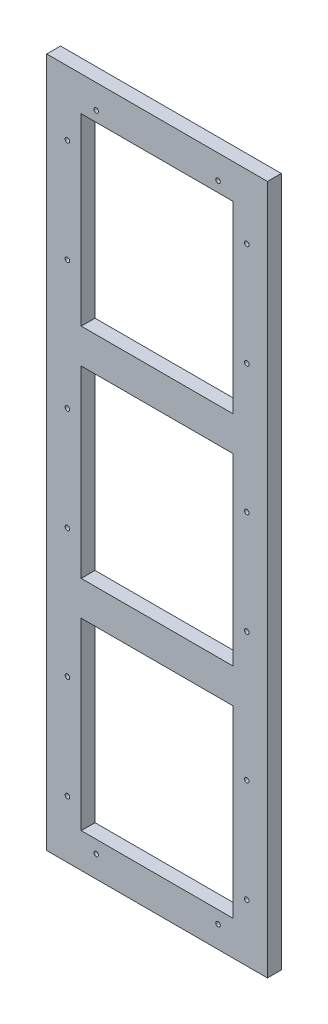
ISO-10303-21;
HEADER;
FILE_DESCRIPTION(('STEP AP214'),'2;1');
FILE_NAME('part.step','',(''),(''),'','','');
FILE_SCHEMA(('AUTOMOTIVE_DESIGN { 1 0 10303 214 1 1 1 1 }'));
ENDSEC;
DATA;
#1=APPLICATION_CONTEXT('core data for automotive mechanical design processes');
#2=APPLICATION_PROTOCOL_DEFINITION('international standard','automotive_design',2000,#1);
#3=PRODUCT_CONTEXT('',#1,'mechanical');
#4=PRODUCT('Part','Part','',(#3));
#5=PRODUCT_RELATED_PRODUCT_CATEGORY('part','',(#4));
#6=PRODUCT_DEFINITION_FORMATION('','',#4);
#7=PRODUCT_DEFINITION_CONTEXT('part definition',#1,'design');
#8=PRODUCT_DEFINITION('design','',#6,#7);
#9=PRODUCT_DEFINITION_SHAPE('','',#8);
#10=(LENGTH_UNIT() NAMED_UNIT(*) SI_UNIT(.MILLI.,.METRE.));
#11=(NAMED_UNIT(*) PLANE_ANGLE_UNIT() SI_UNIT($,.RADIAN.));
#12=(NAMED_UNIT(*) SI_UNIT($,.STERADIAN.) SOLID_ANGLE_UNIT());
#13=UNCERTAINTY_MEASURE_WITH_UNIT(LENGTH_MEASURE(1.E-05),#10,'distance_accuracy_value','');
#14=(GEOMETRIC_REPRESENTATION_CONTEXT(3) GLOBAL_UNCERTAINTY_ASSIGNED_CONTEXT((#13)) GLOBAL_UNIT_ASSIGNED_CONTEXT((#10,
#11,#12)) REPRESENTATION_CONTEXT('',''));
#15=CARTESIAN_POINT('',(0.,0.,0.));
#16=DIRECTION('',(0.,0.,1.));
#17=DIRECTION('',(1.,0.,0.));
#18=AXIS2_PLACEMENT_3D('',#15,#16,#17);
#19=CARTESIAN_POINT('',(0.,0.,6.));
#20=DIRECTION('',(0.,0.,-1.));
#21=DIRECTION('',(-1.,0.,0.));
#22=AXIS2_PLACEMENT_3D('',#19,#20,#21);
#23=PLANE('',#22);
#24=CARTESIAN_POINT('',(26.5,-134.5,6.));
#25=DIRECTION('',(0.,0.,1.));
#26=DIRECTION('',(1.,0.,0.));
#27=AXIS2_PLACEMENT_3D('',#24,#25,#26);
#28=CIRCLE('',#27,1.);
#29=CARTESIAN_POINT('',(27.5,-134.5,6.));
#30=VERTEX_POINT('',#29);
#31=EDGE_CURVE('E708',#30,#30,#28,.T.);
#32=ORIENTED_EDGE('',*,*,#31,.F.);
#33=EDGE_LOOP('',(#32));
#34=FACE_BOUND('',#33,.T.);
#35=CARTESIAN_POINT('',(-26.5,145.5,6.));
#36=DIRECTION('',(0.,0.,1.));
#37=DIRECTION('',(1.,0.,0.));
#38=AXIS2_PLACEMENT_3D('',#35,#36,#37);
#39=CIRCLE('',#38,1.);
#40=CARTESIAN_POINT('',(-25.5,145.5,6.));
#41=VERTEX_POINT('',#40);
#42=EDGE_CURVE('E705',#41,#41,#39,.T.);
#43=ORIENTED_EDGE('',*,*,#42,.F.);
#44=EDGE_LOOP('',(#43));
#45=FACE_BOUND('',#44,.T.);
#46=CARTESIAN_POINT('',(26.5,145.5,6.));
#47=DIRECTION('',(0.,0.,1.));
#48=DIRECTION('',(1.,0.,0.));
#49=AXIS2_PLACEMENT_3D('',#46,#47,#48);
#50=CIRCLE('',#49,1.);
#51=CARTESIAN_POINT('',(27.5,145.5,6.));
#52=VERTEX_POINT('',#51);
#53=EDGE_CURVE('E703',#52,#52,#50,.T.);
#54=ORIENTED_EDGE('',*,*,#53,.F.);
#55=EDGE_LOOP('',(#54));
#56=FACE_BOUND('',#55,.T.);
#57=CARTESIAN_POINT('',(-26.5,-134.5,6.));
#58=DIRECTION('',(0.,0.,1.));
#59=DIRECTION('',(1.,0.,0.));
#60=AXIS2_PLACEMENT_3D('',#57,#58,#59);
#61=CIRCLE('',#60,1.);
#62=CARTESIAN_POINT('',(-25.5,-134.5,6.));
#63=VERTEX_POINT('',#62);
#64=EDGE_CURVE('E315',#63,#63,#61,.T.);
#65=ORIENTED_EDGE('',*,*,#64,.F.);
#66=EDGE_LOOP('',(#65));
#67=FACE_BOUND('',#66,.T.);
#68=CARTESIAN_POINT('',(39.,128.000000000001,6.));
#69=DIRECTION('',(0.,0.,1.));
#70=DIRECTION('',(1.,0.,0.));
#71=AXIS2_PLACEMENT_3D('',#68,#69,#70);
#72=CIRCLE('',#71,0.999999999999998);
#73=CARTESIAN_POINT('',(40.,128.000000000001,6.));
#74=VERTEX_POINT('',#73);
#75=EDGE_CURVE('E335',#74,#74,#72,.T.);
#76=ORIENTED_EDGE('',*,*,#75,.F.);
#77=EDGE_LOOP('',(#76));
#78=FACE_BOUND('',#77,.T.);
#79=CARTESIAN_POINT('',(39.,83.0000000000011,6.));
#80=DIRECTION('',(0.,0.,1.));
#81=DIRECTION('',(1.,0.,0.));
#82=AXIS2_PLACEMENT_3D('',#79,#80,#81);
#83=CIRCLE('',#82,0.999999999999998);
#84=CARTESIAN_POINT('',(40.,83.0000000000011,6.));
#85=VERTEX_POINT('',#84);
#86=EDGE_CURVE('E338',#85,#85,#83,.T.);
#87=ORIENTED_EDGE('',*,*,#86,.F.);
#88=EDGE_LOOP('',(#87));
#89=FACE_BOUND('',#88,.T.);
#90=CARTESIAN_POINT('',(-38.9999999999961,27.,6.));
#91=DIRECTION('',(0.,0.,1.));
#92=DIRECTION('',(1.,0.,0.));
#93=AXIS2_PLACEMENT_3D('',#90,#91,#92);
#94=CIRCLE('',#93,0.999999999999998);
#95=CARTESIAN_POINT('',(-37.9999999999961,27.,6.));
#96=VERTEX_POINT('',#95);
#97=EDGE_CURVE('E341',#96,#96,#94,.T.);
#98=ORIENTED_EDGE('',*,*,#97,.F.);
#99=EDGE_LOOP('',(#98));
#100=FACE_BOUND('',#99,.T.);
#101=CARTESIAN_POINT('',(39.0000000000039,27.0000000000011,6.));
#102=DIRECTION('',(0.,0.,1.));
#103=DIRECTION('',(1.,0.,0.));
#104=AXIS2_PLACEMENT_3D('',#101,#102,#103);
#105=CIRCLE('',#104,0.999999999999998);
#106=CARTESIAN_POINT('',(40.0000000000039,27.0000000000011,6.));
#107=VERTEX_POINT('',#106);
#108=EDGE_CURVE('E344',#107,#107,#105,.T.);
#109=ORIENTED_EDGE('',*,*,#108,.F.);
#110=EDGE_LOOP('',(#109));
#111=FACE_BOUND('',#110,.T.);
#112=CARTESIAN_POINT('',(39.0000000000039,-17.9999999999989,6.));
#113=DIRECTION('',(0.,0.,1.));
#114=DIRECTION('',(1.,0.,0.));
#115=AXIS2_PLACEMENT_3D('',#112,#113,#114);
#116=CIRCLE('',#115,0.999999999999998);
#117=CARTESIAN_POINT('',(40.0000000000039,-17.9999999999989,6.));
#118=VERTEX_POINT('',#117);
#119=EDGE_CURVE('E347',#118,#118,#116,.T.);
#120=ORIENTED_EDGE('',*,*,#119,.F.);
#121=EDGE_LOOP('',(#120));
#122=FACE_BOUND('',#121,.T.);
#123=CARTESIAN_POINT('',(-38.9999999999961,-18.,6.));
#124=DIRECTION('',(0.,0.,1.));
#125=DIRECTION('',(1.,0.,0.));
#126=AXIS2_PLACEMENT_3D('',#123,#124,#125);
#127=CIRCLE('',#126,0.999999999999998);
#128=CARTESIAN_POINT('',(-37.9999999999961,-18.,6.));
#129=VERTEX_POINT('',#128);
#130=EDGE_CURVE('E350',#129,#129,#127,.T.);
#131=ORIENTED_EDGE('',*,*,#130,.F.);
#132=EDGE_LOOP('',(#131));
#133=FACE_BOUND('',#132,.T.);
#134=CARTESIAN_POINT('',(-38.9999999999922,-74.,6.));
#135=DIRECTION('',(0.,0.,1.));
#136=DIRECTION('',(1.,0.,0.));
#137=AXIS2_PLACEMENT_3D('',#134,#135,#136);
#138=CIRCLE('',#137,0.999999999999998);
#139=CARTESIAN_POINT('',(-37.9999999999922,-74.,6.));
#140=VERTEX_POINT('',#139);
#141=EDGE_CURVE('E353',#140,#140,#138,.T.);
#142=ORIENTED_EDGE('',*,*,#141,.F.);
#143=EDGE_LOOP('',(#142));
#144=FACE_BOUND('',#143,.T.);
#145=CARTESIAN_POINT('',(39.0000000000078,-73.9999999999989,6.));
#146=DIRECTION('',(0.,0.,1.));
#147=DIRECTION('',(1.,0.,0.));
#148=AXIS2_PLACEMENT_3D('',#145,#146,#147);
#149=CIRCLE('',#148,0.999999999999998);
#150=CARTESIAN_POINT('',(40.0000000000078,-73.9999999999989,6.));
#151=VERTEX_POINT('',#150);
#152=EDGE_CURVE('E356',#151,#151,#149,.T.);
#153=ORIENTED_EDGE('',*,*,#152,.F.);
#154=EDGE_LOOP('',(#153));
#155=FACE_BOUND('',#154,.T.);
#156=CARTESIAN_POINT('',(39.0000000000078,-118.999999999999,6.));
#157=DIRECTION('',(0.,0.,1.));
#158=DIRECTION('',(1.,0.,0.));
#159=AXIS2_PLACEMENT_3D('',#156,#157,#158);
#160=CIRCLE('',#159,0.999999999999998);
#161=CARTESIAN_POINT('',(40.0000000000079,-118.999999999999,6.));
#162=VERTEX_POINT('',#161);
#163=EDGE_CURVE('E331',#162,#162,#160,.T.);
#164=ORIENTED_EDGE('',*,*,#163,.F.);
#165=EDGE_LOOP('',(#164));
#166=FACE_BOUND('',#165,.T.);
#167=CARTESIAN_POINT('',(-38.9999999999922,-119.,6.));
#168=DIRECTION('',(0.,0.,1.));
#169=DIRECTION('',(1.,0.,0.));
#170=AXIS2_PLACEMENT_3D('',#167,#168,#169);
#171=CIRCLE('',#170,0.999999999999998);
#172=CARTESIAN_POINT('',(-37.9999999999921,-119.,6.));
#173=VERTEX_POINT('',#172);
#174=EDGE_CURVE('E326',#173,#173,#171,.T.);
#175=ORIENTED_EDGE('',*,*,#174,.F.);
#176=EDGE_LOOP('',(#175));
#177=FACE_BOUND('',#176,.T.);
#178=CARTESIAN_POINT('',(-39.,83.,6.));
#179=DIRECTION('',(0.,0.,1.));
#180=DIRECTION('',(1.,0.,0.));
#181=AXIS2_PLACEMENT_3D('',#178,#179,#180);
#182=CIRCLE('',#181,0.999999999999998);
#183=CARTESIAN_POINT('',(-38.,83.,6.));
#184=VERTEX_POINT('',#183);
#185=EDGE_CURVE('E322',#184,#184,#182,.T.);
#186=ORIENTED_EDGE('',*,*,#185,.F.);
#187=EDGE_LOOP('',(#186));
#188=FACE_BOUND('',#187,.T.);
#189=CARTESIAN_POINT('',(-39.,128.,6.));
#190=DIRECTION('',(0.,0.,1.));
#191=DIRECTION('',(1.,0.,0.));
#192=AXIS2_PLACEMENT_3D('',#189,#190,#191);
#193=CIRCLE('',#192,0.999999999999998);
#194=CARTESIAN_POINT('',(-38.,128.,6.));
#195=VERTEX_POINT('',#194);
#196=EDGE_CURVE('E279',#195,#195,#193,.T.);
#197=ORIENTED_EDGE('',*,*,#196,.F.);
#198=EDGE_LOOP('',(#197));
#199=FACE_BOUND('',#198,.T.);
#200=DIRECTION('',(0.,-1.,0.));
#201=VECTOR('',#200,1.);
#202=CARTESIAN_POINT('',(-33.,-49.,6.));
#203=LINE('',#202,#201);
#204=CARTESIAN_POINT('',(-33.,-49.,6.));
#205=VERTEX_POINT('',#204);
#206=CARTESIAN_POINT('',(-33.,-129.,6.));
#207=VERTEX_POINT('',#206);
#208=EDGE_CURVE('E188',#205,#207,#203,.T.);
#209=ORIENTED_EDGE('',*,*,#208,.F.);
#210=DIRECTION('',(-1.,0.,0.));
#211=VECTOR('',#210,1.);
#212=CARTESIAN_POINT('',(-33.,-49.,6.));
#213=LINE('',#212,#211);
#214=CARTESIAN_POINT('',(33.,-49.,6.));
#215=VERTEX_POINT('',#214);
#216=EDGE_CURVE('E196',#215,#205,#213,.T.);
#217=ORIENTED_EDGE('',*,*,#216,.F.);
#218=DIRECTION('',(0.,1.,0.));
#219=VECTOR('',#218,1.);
#220=CARTESIAN_POINT('',(33.,-49.,6.));
#221=LINE('',#220,#219);
#222=CARTESIAN_POINT('',(33.,-129.,6.));
#223=VERTEX_POINT('',#222);
#224=EDGE_CURVE('E193',#223,#215,#221,.T.);
#225=ORIENTED_EDGE('',*,*,#224,.F.);
#226=DIRECTION('',(1.,0.,0.));
#227=VECTOR('',#226,1.);
#228=CARTESIAN_POINT('',(-33.,-129.,6.));
#229=LINE('',#228,#227);
#230=EDGE_CURVE('E190',#207,#223,#229,.T.);
#231=ORIENTED_EDGE('',*,*,#230,.F.);
#232=EDGE_LOOP('',(#209,#217,#225,#231));
#233=FACE_BOUND('',#232,.T.);
#234=DIRECTION('',(0.,1.,0.));
#235=VECTOR('',#234,1.);
#236=CARTESIAN_POINT('',(48.,-144.,6.));
#237=LINE('',#236,#235);
#238=CARTESIAN_POINT('',(48.,-144.,6.));
#239=VERTEX_POINT('',#238);
#240=CARTESIAN_POINT('',(48.,156.,6.));
#241=VERTEX_POINT('',#240);
#242=EDGE_CURVE('E250',#239,#241,#237,.T.);
#243=ORIENTED_EDGE('',*,*,#242,.T.);
#244=DIRECTION('',(-1.,0.,0.));
#245=VECTOR('',#244,1.);
#246=CARTESIAN_POINT('',(-48.,156.,6.));
#247=LINE('',#246,#245);
#248=CARTESIAN_POINT('',(-48.,156.,6.));
#249=VERTEX_POINT('',#248);
#250=EDGE_CURVE('E253',#241,#249,#247,.T.);
#251=ORIENTED_EDGE('',*,*,#250,.T.);
#252=DIRECTION('',(0.,-1.,0.));
#253=VECTOR('',#252,1.);
#254=CARTESIAN_POINT('',(-48.,-144.,6.));
#255=LINE('',#254,#253);
#256=CARTESIAN_POINT('',(-48.,-144.,6.));
#257=VERTEX_POINT('',#256);
#258=EDGE_CURVE('E256',#249,#257,#255,.T.);
#259=ORIENTED_EDGE('',*,*,#258,.T.);
#260=DIRECTION('',(1.,0.,0.));
#261=VECTOR('',#260,1.);
#262=CARTESIAN_POINT('',(-48.,-144.,6.));
#263=LINE('',#262,#261);
#264=EDGE_CURVE('E258',#257,#239,#263,.T.);
#265=ORIENTED_EDGE('',*,*,#264,.T.);
#266=EDGE_LOOP('',(#243,#251,#259,#265));
#267=FACE_BOUND('',#266,.T.);
#268=DIRECTION('',(-1.,0.,0.));
#269=VECTOR('',#268,1.);
#270=CARTESIAN_POINT('',(-33.,141.,6.));
#271=LINE('',#270,#269);
#272=CARTESIAN_POINT('',(33.,141.,6.));
#273=VERTEX_POINT('',#272);
#274=CARTESIAN_POINT('',(-33.,141.,6.));
#275=VERTEX_POINT('',#274);
#276=EDGE_CURVE('E219',#273,#275,#271,.T.);
#277=ORIENTED_EDGE('',*,*,#276,.F.);
#278=DIRECTION('',(0.,1.,0.));
#279=VECTOR('',#278,1.);
#280=CARTESIAN_POINT('',(33.,141.,6.));
#281=LINE('',#280,#279);
#282=CARTESIAN_POINT('',(33.,61.,6.));
#283=VERTEX_POINT('',#282);
#284=EDGE_CURVE('E227',#283,#273,#281,.T.);
#285=ORIENTED_EDGE('',*,*,#284,.F.);
#286=DIRECTION('',(1.,0.,0.));
#287=VECTOR('',#286,1.);
#288=CARTESIAN_POINT('',(-33.,61.,6.));
#289=LINE('',#288,#287);
#290=CARTESIAN_POINT('',(-33.,61.,6.));
#291=VERTEX_POINT('',#290);
#292=EDGE_CURVE('E224',#291,#283,#289,.T.);
#293=ORIENTED_EDGE('',*,*,#292,.F.);
#294=DIRECTION('',(0.,-1.,0.));
#295=VECTOR('',#294,1.);
#296=CARTESIAN_POINT('',(-33.,61.,6.));
#297=LINE('',#296,#295);
#298=EDGE_CURVE('E221',#275,#291,#297,.T.);
#299=ORIENTED_EDGE('',*,*,#298,.F.);
#300=EDGE_LOOP('',(#277,#285,#293,#299));
#301=FACE_BOUND('',#300,.T.);
#302=DIRECTION('',(0.,1.,0.));
#303=VECTOR('',#302,1.);
#304=CARTESIAN_POINT('',(33.,46.,6.));
#305=LINE('',#304,#303);
#306=CARTESIAN_POINT('',(33.,-34.,6.));
#307=VERTEX_POINT('',#306);
#308=CARTESIAN_POINT('',(33.,46.,6.));
#309=VERTEX_POINT('',#308);
#310=EDGE_CURVE('E150',#307,#309,#305,.T.);
#311=ORIENTED_EDGE('',*,*,#310,.F.);
#312=DIRECTION('',(1.,0.,0.));
#313=VECTOR('',#312,1.);
#314=CARTESIAN_POINT('',(-33.,-34.,6.));
#315=LINE('',#314,#313);
#316=CARTESIAN_POINT('',(-33.,-34.,6.));
#317=VERTEX_POINT('',#316);
#318=EDGE_CURVE('E172',#317,#307,#315,.T.);
#319=ORIENTED_EDGE('',*,*,#318,.F.);
#320=DIRECTION('',(0.,-1.,0.));
#321=VECTOR('',#320,1.);
#322=CARTESIAN_POINT('',(-33.,46.,6.));
#323=LINE('',#322,#321);
#324=CARTESIAN_POINT('',(-33.,46.,6.));
#325=VERTEX_POINT('',#324);
#326=EDGE_CURVE('E170',#325,#317,#323,.T.);
#327=ORIENTED_EDGE('',*,*,#326,.F.);
#328=DIRECTION('',(-1.,0.,0.));
#329=VECTOR('',#328,1.);
#330=CARTESIAN_POINT('',(-33.,46.,6.));
#331=LINE('',#330,#329);
#332=EDGE_CURVE('E158',#309,#325,#331,.T.);
#333=ORIENTED_EDGE('',*,*,#332,.F.);
#334=EDGE_LOOP('',(#311,#319,#327,#333));
#335=FACE_BOUND('',#334,.T.);
#336=ADVANCED_FACE('F35',(#34,#45,#56,#67,#78,#89,#100,#111,#122,#133,#144,#155,#166,#177,#188,
#199,#233,#267,#301,#335),#23,.F.);
#337=CARTESIAN_POINT('',(0.,0.,0.));
#338=DIRECTION('',(0.,0.,-1.));
#339=DIRECTION('',(-1.,0.,0.));
#340=AXIS2_PLACEMENT_3D('',#337,#338,#339);
#341=PLANE('',#340);
#342=CARTESIAN_POINT('',(26.5,-134.5,0.));
#343=DIRECTION('',(0.,0.,-1.));
#344=DIRECTION('',(-1.,0.,0.));
#345=AXIS2_PLACEMENT_3D('',#342,#343,#344);
#346=CIRCLE('',#345,1.);
#347=CARTESIAN_POINT('',(25.5,-134.5,0.));
#348=VERTEX_POINT('',#347);
#349=EDGE_CURVE('E39',#348,#348,#346,.T.);
#350=ORIENTED_EDGE('',*,*,#349,.F.);
#351=EDGE_LOOP('',(#350));
#352=FACE_BOUND('',#351,.T.);
#353=CARTESIAN_POINT('',(-26.5,145.5,0.));
#354=DIRECTION('',(0.,0.,-1.));
#355=DIRECTION('',(-1.,0.,0.));
#356=AXIS2_PLACEMENT_3D('',#353,#354,#355);
#357=CIRCLE('',#356,1.);
#358=CARTESIAN_POINT('',(-27.5,145.5,0.));
#359=VERTEX_POINT('',#358);
#360=EDGE_CURVE('E317',#359,#359,#357,.T.);
#361=ORIENTED_EDGE('',*,*,#360,.F.);
#362=EDGE_LOOP('',(#361));
#363=FACE_BOUND('',#362,.T.);
#364=CARTESIAN_POINT('',(26.5,145.5,0.));
#365=DIRECTION('',(0.,0.,-1.));
#366=DIRECTION('',(-1.,0.,0.));
#367=AXIS2_PLACEMENT_3D('',#364,#365,#366);
#368=CIRCLE('',#367,1.);
#369=CARTESIAN_POINT('',(25.5,145.5,0.));
#370=VERTEX_POINT('',#369);
#371=EDGE_CURVE('E314',#370,#370,#368,.T.);
#372=ORIENTED_EDGE('',*,*,#371,.F.);
#373=EDGE_LOOP('',(#372));
#374=FACE_BOUND('',#373,.T.);
#375=CARTESIAN_POINT('',(-26.5,-134.5,0.));
#376=DIRECTION('',(0.,0.,-1.));
#377=DIRECTION('',(-1.,0.,0.));
#378=AXIS2_PLACEMENT_3D('',#375,#376,#377);
#379=CIRCLE('',#378,1.);
#380=CARTESIAN_POINT('',(-27.5,-134.5,0.));
#381=VERTEX_POINT('',#380);
#382=EDGE_CURVE('E311',#381,#381,#379,.T.);
#383=ORIENTED_EDGE('',*,*,#382,.F.);
#384=EDGE_LOOP('',(#383));
#385=FACE_BOUND('',#384,.T.);
#386=CARTESIAN_POINT('',(39.,128.000000000001,0.));
#387=DIRECTION('',(0.,0.,-1.));
#388=DIRECTION('',(-1.,0.,0.));
#389=AXIS2_PLACEMENT_3D('',#386,#387,#388);
#390=CIRCLE('',#389,0.999999999999998);
#391=CARTESIAN_POINT('',(38.,128.000000000001,0.));
#392=VERTEX_POINT('',#391);
#393=EDGE_CURVE('E178',#392,#392,#390,.T.);
#394=ORIENTED_EDGE('',*,*,#393,.F.);
#395=EDGE_LOOP('',(#394));
#396=FACE_BOUND('',#395,.T.);
#397=CARTESIAN_POINT('',(39.,83.0000000000011,0.));
#398=DIRECTION('',(0.,0.,-1.));
#399=DIRECTION('',(-1.,0.,0.));
#400=AXIS2_PLACEMENT_3D('',#397,#398,#399);
#401=CIRCLE('',#400,0.999999999999998);
#402=CARTESIAN_POINT('',(38.,83.0000000000011,0.));
#403=VERTEX_POINT('',#402);
#404=EDGE_CURVE('E306',#403,#403,#401,.T.);
#405=ORIENTED_EDGE('',*,*,#404,.F.);
#406=EDGE_LOOP('',(#405));
#407=FACE_BOUND('',#406,.T.);
#408=CARTESIAN_POINT('',(-38.9999999999961,27.,0.));
#409=DIRECTION('',(0.,0.,-1.));
#410=DIRECTION('',(-1.,0.,0.));
#411=AXIS2_PLACEMENT_3D('',#408,#409,#410);
#412=CIRCLE('',#411,0.999999999999998);
#413=CARTESIAN_POINT('',(-39.9999999999961,27.,0.));
#414=VERTEX_POINT('',#413);
#415=EDGE_CURVE('E303',#414,#414,#412,.T.);
#416=ORIENTED_EDGE('',*,*,#415,.F.);
#417=EDGE_LOOP('',(#416));
#418=FACE_BOUND('',#417,.T.);
#419=CARTESIAN_POINT('',(39.0000000000039,27.0000000000011,0.));
#420=DIRECTION('',(0.,0.,-1.));
#421=DIRECTION('',(-1.,0.,0.));
#422=AXIS2_PLACEMENT_3D('',#419,#420,#421);
#423=CIRCLE('',#422,0.999999999999998);
#424=CARTESIAN_POINT('',(38.0000000000039,27.0000000000011,0.));
#425=VERTEX_POINT('',#424);
#426=EDGE_CURVE('E300',#425,#425,#423,.T.);
#427=ORIENTED_EDGE('',*,*,#426,.F.);
#428=EDGE_LOOP('',(#427));
#429=FACE_BOUND('',#428,.T.);
#430=CARTESIAN_POINT('',(39.0000000000039,-17.9999999999989,0.));
#431=DIRECTION('',(0.,0.,-1.));
#432=DIRECTION('',(-1.,0.,0.));
#433=AXIS2_PLACEMENT_3D('',#430,#431,#432);
#434=CIRCLE('',#433,0.999999999999998);
#435=CARTESIAN_POINT('',(38.0000000000039,-17.9999999999989,0.));
#436=VERTEX_POINT('',#435);
#437=EDGE_CURVE('E297',#436,#436,#434,.T.);
#438=ORIENTED_EDGE('',*,*,#437,.F.);
#439=EDGE_LOOP('',(#438));
#440=FACE_BOUND('',#439,.T.);
#441=CARTESIAN_POINT('',(-38.9999999999961,-18.,0.));
#442=DIRECTION('',(0.,0.,-1.));
#443=DIRECTION('',(-1.,0.,0.));
#444=AXIS2_PLACEMENT_3D('',#441,#442,#443);
#445=CIRCLE('',#444,0.999999999999998);
#446=CARTESIAN_POINT('',(-39.9999999999961,-18.,0.));
#447=VERTEX_POINT('',#446);
#448=EDGE_CURVE('E294',#447,#447,#445,.T.);
#449=ORIENTED_EDGE('',*,*,#448,.F.);
#450=EDGE_LOOP('',(#449));
#451=FACE_BOUND('',#450,.T.);
#452=CARTESIAN_POINT('',(-38.9999999999922,-74.,0.));
#453=DIRECTION('',(0.,0.,-1.));
#454=DIRECTION('',(-1.,0.,0.));
#455=AXIS2_PLACEMENT_3D('',#452,#453,#454);
#456=CIRCLE('',#455,0.999999999999998);
#457=CARTESIAN_POINT('',(-39.9999999999922,-74.,0.));
#458=VERTEX_POINT('',#457);
#459=EDGE_CURVE('E291',#458,#458,#456,.T.);
#460=ORIENTED_EDGE('',*,*,#459,.F.);
#461=EDGE_LOOP('',(#460));
#462=FACE_BOUND('',#461,.T.);
#463=CARTESIAN_POINT('',(39.0000000000078,-73.9999999999989,0.));
#464=DIRECTION('',(0.,0.,-1.));
#465=DIRECTION('',(-1.,0.,0.));
#466=AXIS2_PLACEMENT_3D('',#463,#464,#465);
#467=CIRCLE('',#466,0.999999999999998);
#468=CARTESIAN_POINT('',(38.0000000000078,-73.9999999999989,0.));
#469=VERTEX_POINT('',#468);
#470=EDGE_CURVE('E288',#469,#469,#467,.T.);
#471=ORIENTED_EDGE('',*,*,#470,.F.);
#472=EDGE_LOOP('',(#471));
#473=FACE_BOUND('',#472,.T.);
#474=CARTESIAN_POINT('',(39.0000000000078,-118.999999999999,0.));
#475=DIRECTION('',(0.,0.,-1.));
#476=DIRECTION('',(-1.,0.,0.));
#477=AXIS2_PLACEMENT_3D('',#474,#475,#476);
#478=CIRCLE('',#477,0.999999999999998);
#479=CARTESIAN_POINT('',(38.0000000000078,-118.999999999999,0.));
#480=VERTEX_POINT('',#479);
#481=EDGE_CURVE('E285',#480,#480,#478,.T.);
#482=ORIENTED_EDGE('',*,*,#481,.F.);
#483=EDGE_LOOP('',(#482));
#484=FACE_BOUND('',#483,.T.);
#485=CARTESIAN_POINT('',(-38.9999999999922,-119.,0.));
#486=DIRECTION('',(0.,0.,-1.));
#487=DIRECTION('',(-1.,0.,0.));
#488=AXIS2_PLACEMENT_3D('',#485,#486,#487);
#489=CIRCLE('',#488,0.999999999999998);
#490=CARTESIAN_POINT('',(-39.9999999999922,-119.,0.));
#491=VERTEX_POINT('',#490);
#492=EDGE_CURVE('E282',#491,#491,#489,.T.);
#493=ORIENTED_EDGE('',*,*,#492,.F.);
#494=EDGE_LOOP('',(#493));
#495=FACE_BOUND('',#494,.T.);
#496=CARTESIAN_POINT('',(-39.,83.,0.));
#497=DIRECTION('',(0.,0.,-1.));
#498=DIRECTION('',(-1.,0.,0.));
#499=AXIS2_PLACEMENT_3D('',#496,#497,#498);
#500=CIRCLE('',#499,0.999999999999998);
#501=CARTESIAN_POINT('',(-40.,83.,0.));
#502=VERTEX_POINT('',#501);
#503=EDGE_CURVE('E278',#502,#502,#500,.T.);
#504=ORIENTED_EDGE('',*,*,#503,.F.);
#505=EDGE_LOOP('',(#504));
#506=FACE_BOUND('',#505,.T.);
#507=CARTESIAN_POINT('',(-39.,128.,0.));
#508=DIRECTION('',(0.,0.,-1.));
#509=DIRECTION('',(-1.,0.,0.));
#510=AXIS2_PLACEMENT_3D('',#507,#508,#509);
#511=CIRCLE('',#510,0.999999999999998);
#512=CARTESIAN_POINT('',(-40.,128.,0.));
#513=VERTEX_POINT('',#512);
#514=EDGE_CURVE('E275',#513,#513,#511,.T.);
#515=ORIENTED_EDGE('',*,*,#514,.F.);
#516=EDGE_LOOP('',(#515));
#517=FACE_BOUND('',#516,.T.);
#518=DIRECTION('',(0.,1.,0.));
#519=VECTOR('',#518,1.);
#520=CARTESIAN_POINT('',(48.,-144.,0.));
#521=LINE('',#520,#519);
#522=CARTESIAN_POINT('',(48.,-144.,0.));
#523=VERTEX_POINT('',#522);
#524=CARTESIAN_POINT('',(48.,156.,0.));
#525=VERTEX_POINT('',#524);
#526=EDGE_CURVE('E249',#523,#525,#521,.T.);
#527=ORIENTED_EDGE('',*,*,#526,.F.);
#528=DIRECTION('',(1.,0.,0.));
#529=VECTOR('',#528,1.);
#530=CARTESIAN_POINT('',(-48.,-144.,0.));
#531=LINE('',#530,#529);
#532=CARTESIAN_POINT('',(-48.,-144.,0.));
#533=VERTEX_POINT('',#532);
#534=EDGE_CURVE('E254',#533,#523,#531,.T.);
#535=ORIENTED_EDGE('',*,*,#534,.F.);
#536=DIRECTION('',(0.,-1.,0.));
#537=VECTOR('',#536,1.);
#538=CARTESIAN_POINT('',(-48.,-144.,0.));
#539=LINE('',#538,#537);
#540=CARTESIAN_POINT('',(-48.,156.,0.));
#541=VERTEX_POINT('',#540);
#542=EDGE_CURVE('E265',#541,#533,#539,.T.);
#543=ORIENTED_EDGE('',*,*,#542,.F.);
#544=DIRECTION('',(-1.,0.,0.));
#545=VECTOR('',#544,1.);
#546=CARTESIAN_POINT('',(-48.,156.,0.));
#547=LINE('',#546,#545);
#548=EDGE_CURVE('E263',#525,#541,#547,.T.);
#549=ORIENTED_EDGE('',*,*,#548,.F.);
#550=EDGE_LOOP('',(#527,#535,#543,#549));
#551=FACE_BOUND('',#550,.T.);
#552=DIRECTION('',(0.,1.,0.));
#553=VECTOR('',#552,1.);
#554=CARTESIAN_POINT('',(33.,141.,0.));
#555=LINE('',#554,#553);
#556=CARTESIAN_POINT('',(33.,61.,0.));
#557=VERTEX_POINT('',#556);
#558=CARTESIAN_POINT('',(33.,141.,0.));
#559=VERTEX_POINT('',#558);
#560=EDGE_CURVE('E222',#557,#559,#555,.T.);
#561=ORIENTED_EDGE('',*,*,#560,.T.);
#562=DIRECTION('',(-1.,0.,0.));
#563=VECTOR('',#562,1.);
#564=CARTESIAN_POINT('',(-33.,141.,0.));
#565=LINE('',#564,#563);
#566=CARTESIAN_POINT('',(-33.,141.,0.));
#567=VERTEX_POINT('',#566);
#568=EDGE_CURVE('E218',#559,#567,#565,.T.);
#569=ORIENTED_EDGE('',*,*,#568,.T.);
#570=DIRECTION('',(0.,-1.,0.));
#571=VECTOR('',#570,1.);
#572=CARTESIAN_POINT('',(-33.,61.,0.));
#573=LINE('',#572,#571);
#574=CARTESIAN_POINT('',(-33.,61.,0.));
#575=VERTEX_POINT('',#574);
#576=EDGE_CURVE('E232',#567,#575,#573,.T.);
#577=ORIENTED_EDGE('',*,*,#576,.T.);
#578=DIRECTION('',(1.,0.,0.));
#579=VECTOR('',#578,1.);
#580=CARTESIAN_POINT('',(-33.,61.,0.));
#581=LINE('',#580,#579);
#582=EDGE_CURVE('E235',#575,#557,#581,.T.);
#583=ORIENTED_EDGE('',*,*,#582,.T.);
#584=EDGE_LOOP('',(#561,#569,#577,#583));
#585=FACE_BOUND('',#584,.T.);
#586=DIRECTION('',(-1.,0.,0.));
#587=VECTOR('',#586,1.);
#588=CARTESIAN_POINT('',(-33.,-49.,0.));
#589=LINE('',#588,#587);
#590=CARTESIAN_POINT('',(33.,-49.,0.));
#591=VERTEX_POINT('',#590);
#592=CARTESIAN_POINT('',(-33.,-49.,0.));
#593=VERTEX_POINT('',#592);
#594=EDGE_CURVE('E191',#591,#593,#589,.T.);
#595=ORIENTED_EDGE('',*,*,#594,.T.);
#596=DIRECTION('',(0.,-1.,0.));
#597=VECTOR('',#596,1.);
#598=CARTESIAN_POINT('',(-33.,-49.,0.));
#599=LINE('',#598,#597);
#600=CARTESIAN_POINT('',(-33.,-129.,0.));
#601=VERTEX_POINT('',#600);
#602=EDGE_CURVE('E166',#593,#601,#599,.T.);
#603=ORIENTED_EDGE('',*,*,#602,.T.);
#604=DIRECTION('',(1.,0.,0.));
#605=VECTOR('',#604,1.);
#606=CARTESIAN_POINT('',(-33.,-129.,0.));
#607=LINE('',#606,#605);
#608=CARTESIAN_POINT('',(33.,-129.,0.));
#609=VERTEX_POINT('',#608);
#610=EDGE_CURVE('E201',#601,#609,#607,.T.);
#611=ORIENTED_EDGE('',*,*,#610,.T.);
#612=DIRECTION('',(0.,1.,0.));
#613=VECTOR('',#612,1.);
#614=CARTESIAN_POINT('',(33.,-49.,0.));
#615=LINE('',#614,#613);
#616=EDGE_CURVE('E204',#609,#591,#615,.T.);
#617=ORIENTED_EDGE('',*,*,#616,.T.);
#618=EDGE_LOOP('',(#595,#603,#611,#617));
#619=FACE_BOUND('',#618,.T.);
#620=DIRECTION('',(1.,0.,0.));
#621=VECTOR('',#620,1.);
#622=CARTESIAN_POINT('',(-33.,-34.,0.));
#623=LINE('',#622,#621);
#624=CARTESIAN_POINT('',(-33.,-34.,0.));
#625=VERTEX_POINT('',#624);
#626=CARTESIAN_POINT('',(33.,-34.,0.));
#627=VERTEX_POINT('',#626);
#628=EDGE_CURVE('E159',#625,#627,#623,.T.);
#629=ORIENTED_EDGE('',*,*,#628,.T.);
#630=DIRECTION('',(0.,1.,0.));
#631=VECTOR('',#630,1.);
#632=CARTESIAN_POINT('',(33.,46.,0.));
#633=LINE('',#632,#631);
#634=CARTESIAN_POINT('',(33.,46.,0.));
#635=VERTEX_POINT('',#634);
#636=EDGE_CURVE('E60',#627,#635,#633,.T.);
#637=ORIENTED_EDGE('',*,*,#636,.T.);
#638=DIRECTION('',(-1.,0.,0.));
#639=VECTOR('',#638,1.);
#640=CARTESIAN_POINT('',(-33.,46.,0.));
#641=LINE('',#640,#639);
#642=CARTESIAN_POINT('',(-33.,46.,0.));
#643=VERTEX_POINT('',#642);
#644=EDGE_CURVE('E165',#635,#643,#641,.T.);
#645=ORIENTED_EDGE('',*,*,#644,.T.);
#646=DIRECTION('',(0.,-1.,0.));
#647=VECTOR('',#646,1.);
#648=CARTESIAN_POINT('',(-33.,46.,0.));
#649=LINE('',#648,#647);
#650=EDGE_CURVE('E180',#643,#625,#649,.T.);
#651=ORIENTED_EDGE('',*,*,#650,.T.);
#652=EDGE_LOOP('',(#629,#637,#645,#651));
#653=FACE_BOUND('',#652,.T.);
#654=ADVANCED_FACE('F365',(#352,#363,#374,#385,#396,#407,#418,#429,#440,#451,#462,#473,#484,
#495,#506,#517,#551,#585,#619,#653),#341,.T.);
#655=CARTESIAN_POINT('',(48.,-144.,6.));
#656=DIRECTION('',(-1.,0.,0.));
#657=DIRECTION('',(0.,-1.,0.));
#658=AXIS2_PLACEMENT_3D('',#655,#656,#657);
#659=PLANE('',#658);
#660=ORIENTED_EDGE('',*,*,#526,.T.);
#661=DIRECTION('',(0.,0.,-1.));
#662=VECTOR('',#661,1.);
#663=CARTESIAN_POINT('',(48.,156.,6.));
#664=LINE('',#663,#662);
#665=EDGE_CURVE('E11',#241,#525,#664,.T.);
#666=ORIENTED_EDGE('',*,*,#665,.F.);
#667=ORIENTED_EDGE('',*,*,#242,.F.);
#668=DIRECTION('',(0.,0.,-1.));
#669=VECTOR('',#668,1.);
#670=CARTESIAN_POINT('',(48.,-144.,6.));
#671=LINE('',#670,#669);
#672=EDGE_CURVE('E260',#239,#523,#671,.T.);
#673=ORIENTED_EDGE('',*,*,#672,.T.);
#674=EDGE_LOOP('',(#660,#666,#667,#673));
#675=FACE_BOUND('',#674,.T.);
#676=ADVANCED_FACE('F37',(#675),#659,.F.);
#677=CARTESIAN_POINT('',(-48.,156.,6.));
#678=DIRECTION('',(0.,-1.,0.));
#679=DIRECTION('',(0.,0.,-1.));
#680=AXIS2_PLACEMENT_3D('',#677,#678,#679);
#681=PLANE('',#680);
#682=ORIENTED_EDGE('',*,*,#548,.T.);
#683=DIRECTION('',(0.,0.,-1.));
#684=VECTOR('',#683,1.);
#685=CARTESIAN_POINT('',(-48.,156.,6.));
#686=LINE('',#685,#684);
#687=EDGE_CURVE('E44',#249,#541,#686,.T.);
#688=ORIENTED_EDGE('',*,*,#687,.F.);
#689=ORIENTED_EDGE('',*,*,#250,.F.);
#690=ORIENTED_EDGE('',*,*,#665,.T.);
#691=EDGE_LOOP('',(#682,#688,#689,#690));
#692=FACE_BOUND('',#691,.T.);
#693=ADVANCED_FACE('F416',(#692),#681,.F.);
#694=CARTESIAN_POINT('',(-48.,-144.,6.));
#695=DIRECTION('',(1.,0.,0.));
#696=DIRECTION('',(0.,1.,0.));
#697=AXIS2_PLACEMENT_3D('',#694,#695,#696);
#698=PLANE('',#697);
#699=ORIENTED_EDGE('',*,*,#542,.T.);
#700=DIRECTION('',(0.,0.,-1.));
#701=VECTOR('',#700,1.);
#702=CARTESIAN_POINT('',(-48.,-144.,6.));
#703=LINE('',#702,#701);
#704=EDGE_CURVE('E270',#257,#533,#703,.T.);
#705=ORIENTED_EDGE('',*,*,#704,.F.);
#706=ORIENTED_EDGE('',*,*,#258,.F.);
#707=ORIENTED_EDGE('',*,*,#687,.T.);
#708=EDGE_LOOP('',(#699,#705,#706,#707));
#709=FACE_BOUND('',#708,.T.);
#710=ADVANCED_FACE('F413',(#709),#698,.F.);
#711=CARTESIAN_POINT('',(-48.,-144.,6.));
#712=DIRECTION('',(0.,1.,0.));
#713=DIRECTION('',(0.,0.,1.));
#714=AXIS2_PLACEMENT_3D('',#711,#712,#713);
#715=PLANE('',#714);
#716=ORIENTED_EDGE('',*,*,#534,.T.);
#717=ORIENTED_EDGE('',*,*,#672,.F.);
#718=ORIENTED_EDGE('',*,*,#264,.F.);
#719=ORIENTED_EDGE('',*,*,#704,.T.);
#720=EDGE_LOOP('',(#716,#717,#718,#719));
#721=FACE_BOUND('',#720,.T.);
#722=ADVANCED_FACE('F406',(#721),#715,.F.);
#723=CARTESIAN_POINT('',(-33.,141.,6.));
#724=DIRECTION('',(0.,-1.,0.));
#725=DIRECTION('',(0.,0.,-1.));
#726=AXIS2_PLACEMENT_3D('',#723,#724,#725);
#727=PLANE('',#726);
#728=ORIENTED_EDGE('',*,*,#568,.F.);
#729=DIRECTION('',(0.,0.,-1.));
#730=VECTOR('',#729,1.);
#731=CARTESIAN_POINT('',(33.,141.,6.));
#732=LINE('',#731,#730);
#733=EDGE_CURVE('E229',#273,#559,#732,.T.);
#734=ORIENTED_EDGE('',*,*,#733,.F.);
#735=ORIENTED_EDGE('',*,*,#276,.T.);
#736=DIRECTION('',(0.,0.,-1.));
#737=VECTOR('',#736,1.);
#738=CARTESIAN_POINT('',(-33.,141.,6.));
#739=LINE('',#738,#737);
#740=EDGE_CURVE('E246',#275,#567,#739,.T.);
#741=ORIENTED_EDGE('',*,*,#740,.T.);
#742=EDGE_LOOP('',(#728,#734,#735,#741));
#743=FACE_BOUND('',#742,.T.);
#744=ADVANCED_FACE('F382',(#743),#727,.T.);
#745=CARTESIAN_POINT('',(-33.,61.,6.));
#746=DIRECTION('',(1.,0.,0.));
#747=DIRECTION('',(0.,1.,0.));
#748=AXIS2_PLACEMENT_3D('',#745,#746,#747);
#749=PLANE('',#748);
#750=ORIENTED_EDGE('',*,*,#576,.F.);
#751=ORIENTED_EDGE('',*,*,#740,.F.);
#752=ORIENTED_EDGE('',*,*,#298,.T.);
#753=DIRECTION('',(0.,0.,-1.));
#754=VECTOR('',#753,1.);
#755=CARTESIAN_POINT('',(-33.,61.,6.));
#756=LINE('',#755,#754);
#757=EDGE_CURVE('E244',#291,#575,#756,.T.);
#758=ORIENTED_EDGE('',*,*,#757,.T.);
#759=EDGE_LOOP('',(#750,#751,#752,#758));
#760=FACE_BOUND('',#759,.T.);
#761=ADVANCED_FACE('F384',(#760),#749,.T.);
#762=CARTESIAN_POINT('',(-33.,61.,6.));
#763=DIRECTION('',(0.,1.,0.));
#764=DIRECTION('',(0.,0.,1.));
#765=AXIS2_PLACEMENT_3D('',#762,#763,#764);
#766=PLANE('',#765);
#767=ORIENTED_EDGE('',*,*,#582,.F.);
#768=ORIENTED_EDGE('',*,*,#757,.F.);
#769=ORIENTED_EDGE('',*,*,#292,.T.);
#770=DIRECTION('',(0.,0.,-1.));
#771=VECTOR('',#770,1.);
#772=CARTESIAN_POINT('',(33.,61.,6.));
#773=LINE('',#772,#771);
#774=EDGE_CURVE('E242',#283,#557,#773,.T.);
#775=ORIENTED_EDGE('',*,*,#774,.T.);
#776=EDGE_LOOP('',(#767,#768,#769,#775));
#777=FACE_BOUND('',#776,.T.);
#778=ADVANCED_FACE('F393',(#777),#766,.T.);
#779=CARTESIAN_POINT('',(33.,141.,6.));
#780=DIRECTION('',(-1.,0.,0.));
#781=DIRECTION('',(0.,-1.,0.));
#782=AXIS2_PLACEMENT_3D('',#779,#780,#781);
#783=PLANE('',#782);
#784=ORIENTED_EDGE('',*,*,#560,.F.);
#785=ORIENTED_EDGE('',*,*,#774,.F.);
#786=ORIENTED_EDGE('',*,*,#284,.T.);
#787=ORIENTED_EDGE('',*,*,#733,.T.);
#788=EDGE_LOOP('',(#784,#785,#786,#787));
#789=FACE_BOUND('',#788,.T.);
#790=ADVANCED_FACE('F391',(#789),#783,.T.);
#791=CARTESIAN_POINT('',(-33.,-49.,6.));
#792=DIRECTION('',(1.,0.,0.));
#793=DIRECTION('',(0.,1.,0.));
#794=AXIS2_PLACEMENT_3D('',#791,#792,#793);
#795=PLANE('',#794);
#796=ORIENTED_EDGE('',*,*,#602,.F.);
#797=DIRECTION('',(0.,0.,-1.));
#798=VECTOR('',#797,1.);
#799=CARTESIAN_POINT('',(-33.,-49.,6.));
#800=LINE('',#799,#798);
#801=EDGE_CURVE('E198',#205,#593,#800,.T.);
#802=ORIENTED_EDGE('',*,*,#801,.F.);
#803=ORIENTED_EDGE('',*,*,#208,.T.);
#804=DIRECTION('',(0.,0.,-1.));
#805=VECTOR('',#804,1.);
#806=CARTESIAN_POINT('',(-33.,-129.,6.));
#807=LINE('',#806,#805);
#808=EDGE_CURVE('E215',#207,#601,#807,.T.);
#809=ORIENTED_EDGE('',*,*,#808,.T.);
#810=EDGE_LOOP('',(#796,#802,#803,#809));
#811=FACE_BOUND('',#810,.T.);
#812=ADVANCED_FACE('F400',(#811),#795,.T.);
#813=CARTESIAN_POINT('',(-33.,-129.,6.));
#814=DIRECTION('',(0.,1.,0.));
#815=DIRECTION('',(0.,0.,1.));
#816=AXIS2_PLACEMENT_3D('',#813,#814,#815);
#817=PLANE('',#816);
#818=ORIENTED_EDGE('',*,*,#610,.F.);
#819=ORIENTED_EDGE('',*,*,#808,.F.);
#820=ORIENTED_EDGE('',*,*,#230,.T.);
#821=DIRECTION('',(0.,0.,-1.));
#822=VECTOR('',#821,1.);
#823=CARTESIAN_POINT('',(33.,-129.,6.));
#824=LINE('',#823,#822);
#825=EDGE_CURVE('E213',#223,#609,#824,.T.);
#826=ORIENTED_EDGE('',*,*,#825,.T.);
#827=EDGE_LOOP('',(#818,#819,#820,#826));
#828=FACE_BOUND('',#827,.T.);
#829=ADVANCED_FACE('F621',(#828),#817,.T.);
#830=CARTESIAN_POINT('',(33.,-49.,6.));
#831=DIRECTION('',(-1.,0.,0.));
#832=DIRECTION('',(0.,-1.,0.));
#833=AXIS2_PLACEMENT_3D('',#830,#831,#832);
#834=PLANE('',#833);
#835=ORIENTED_EDGE('',*,*,#616,.F.);
#836=ORIENTED_EDGE('',*,*,#825,.F.);
#837=ORIENTED_EDGE('',*,*,#224,.T.);
#838=DIRECTION('',(0.,0.,-1.));
#839=VECTOR('',#838,1.);
#840=CARTESIAN_POINT('',(33.,-49.,6.));
#841=LINE('',#840,#839);
#842=EDGE_CURVE('E211',#215,#591,#841,.T.);
#843=ORIENTED_EDGE('',*,*,#842,.T.);
#844=EDGE_LOOP('',(#835,#836,#837,#843));
#845=FACE_BOUND('',#844,.T.);
#846=ADVANCED_FACE('F611',(#845),#834,.T.);
#847=CARTESIAN_POINT('',(-33.,-49.,6.));
#848=DIRECTION('',(0.,-1.,0.));
#849=DIRECTION('',(0.,0.,-1.));
#850=AXIS2_PLACEMENT_3D('',#847,#848,#849);
#851=PLANE('',#850);
#852=ORIENTED_EDGE('',*,*,#594,.F.);
#853=ORIENTED_EDGE('',*,*,#842,.F.);
#854=ORIENTED_EDGE('',*,*,#216,.T.);
#855=ORIENTED_EDGE('',*,*,#801,.T.);
#856=EDGE_LOOP('',(#852,#853,#854,#855));
#857=FACE_BOUND('',#856,.T.);
#858=ADVANCED_FACE('F602',(#857),#851,.T.);
#859=CARTESIAN_POINT('',(33.,46.,6.));
#860=DIRECTION('',(-1.,0.,0.));
#861=DIRECTION('',(0.,-1.,0.));
#862=AXIS2_PLACEMENT_3D('',#859,#860,#861);
#863=PLANE('',#862);
#864=ORIENTED_EDGE('',*,*,#636,.F.);
#865=DIRECTION('',(0.,0.,-1.));
#866=VECTOR('',#865,1.);
#867=CARTESIAN_POINT('',(33.,-34.,6.));
#868=LINE('',#867,#866);
#869=EDGE_CURVE('E154',#307,#627,#868,.T.);
#870=ORIENTED_EDGE('',*,*,#869,.F.);
#871=ORIENTED_EDGE('',*,*,#310,.T.);
#872=DIRECTION('',(0.,0.,-1.));
#873=VECTOR('',#872,1.);
#874=CARTESIAN_POINT('',(33.,46.,6.));
#875=LINE('',#874,#873);
#876=EDGE_CURVE('E153',#309,#635,#875,.T.);
#877=ORIENTED_EDGE('',*,*,#876,.T.);
#878=EDGE_LOOP('',(#864,#870,#871,#877));
#879=FACE_BOUND('',#878,.T.);
#880=ADVANCED_FACE('F152',(#879),#863,.T.);
#881=CARTESIAN_POINT('',(-33.,46.,6.));
#882=DIRECTION('',(0.,-1.,0.));
#883=DIRECTION('',(0.,0.,-1.));
#884=AXIS2_PLACEMENT_3D('',#881,#882,#883);
#885=PLANE('',#884);
#886=ORIENTED_EDGE('',*,*,#644,.F.);
#887=ORIENTED_EDGE('',*,*,#876,.F.);
#888=ORIENTED_EDGE('',*,*,#332,.T.);
#889=DIRECTION('',(0.,0.,-1.));
#890=VECTOR('',#889,1.);
#891=CARTESIAN_POINT('',(-33.,46.,6.));
#892=LINE('',#891,#890);
#893=EDGE_CURVE('E167',#325,#643,#892,.T.);
#894=ORIENTED_EDGE('',*,*,#893,.T.);
#895=EDGE_LOOP('',(#886,#887,#888,#894));
#896=FACE_BOUND('',#895,.T.);
#897=ADVANCED_FACE('F162',(#896),#885,.T.);
#898=CARTESIAN_POINT('',(-33.,46.,6.));
#899=DIRECTION('',(1.,0.,0.));
#900=DIRECTION('',(0.,1.,0.));
#901=AXIS2_PLACEMENT_3D('',#898,#899,#900);
#902=PLANE('',#901);
#903=ORIENTED_EDGE('',*,*,#650,.F.);
#904=ORIENTED_EDGE('',*,*,#893,.F.);
#905=ORIENTED_EDGE('',*,*,#326,.T.);
#906=DIRECTION('',(0.,0.,-1.));
#907=VECTOR('',#906,1.);
#908=CARTESIAN_POINT('',(-33.,-34.,6.));
#909=LINE('',#908,#907);
#910=EDGE_CURVE('E52',#317,#625,#909,.T.);
#911=ORIENTED_EDGE('',*,*,#910,.T.);
#912=EDGE_LOOP('',(#903,#904,#905,#911));
#913=FACE_BOUND('',#912,.T.);
#914=ADVANCED_FACE('F576',(#913),#902,.T.);
#915=CARTESIAN_POINT('',(-33.,-34.,6.));
#916=DIRECTION('',(0.,1.,0.));
#917=DIRECTION('',(0.,0.,1.));
#918=AXIS2_PLACEMENT_3D('',#915,#916,#917);
#919=PLANE('',#918);
#920=ORIENTED_EDGE('',*,*,#628,.F.);
#921=ORIENTED_EDGE('',*,*,#910,.F.);
#922=ORIENTED_EDGE('',*,*,#318,.T.);
#923=ORIENTED_EDGE('',*,*,#869,.T.);
#924=EDGE_LOOP('',(#920,#921,#922,#923));
#925=FACE_BOUND('',#924,.T.);
#926=ADVANCED_FACE('F566',(#925),#919,.T.);
#927=CARTESIAN_POINT('',(-39.,128.,-4.));
#928=DIRECTION('',(0.,0.,1.));
#929=DIRECTION('',(1.,0.,0.));
#930=AXIS2_PLACEMENT_3D('',#927,#928,#929);
#931=CYLINDRICAL_SURFACE('',#930,0.999999999999998);
#932=ORIENTED_EDGE('',*,*,#514,.T.);
#933=EDGE_LOOP('',(#932));
#934=FACE_BOUND('',#933,.T.);
#935=ORIENTED_EDGE('',*,*,#196,.T.);
#936=EDGE_LOOP('',(#935));
#937=FACE_BOUND('',#936,.T.);
#938=ADVANCED_FACE('F361',(#934,#937),#931,.F.);
#939=CARTESIAN_POINT('',(-39.,83.,-4.));
#940=DIRECTION('',(0.,0.,1.));
#941=DIRECTION('',(1.,0.,0.));
#942=AXIS2_PLACEMENT_3D('',#939,#940,#941);
#943=CYLINDRICAL_SURFACE('',#942,0.999999999999998);
#944=ORIENTED_EDGE('',*,*,#503,.T.);
#945=EDGE_LOOP('',(#944));
#946=FACE_BOUND('',#945,.T.);
#947=ORIENTED_EDGE('',*,*,#185,.T.);
#948=EDGE_LOOP('',(#947));
#949=FACE_BOUND('',#948,.T.);
#950=ADVANCED_FACE('F547',(#946,#949),#943,.F.);
#951=CARTESIAN_POINT('',(-38.9999999999922,-119.,-4.));
#952=DIRECTION('',(0.,0.,1.));
#953=DIRECTION('',(1.,0.,0.));
#954=AXIS2_PLACEMENT_3D('',#951,#952,#953);
#955=CYLINDRICAL_SURFACE('',#954,0.999999999999998);
#956=ORIENTED_EDGE('',*,*,#492,.T.);
#957=EDGE_LOOP('',(#956));
#958=FACE_BOUND('',#957,.T.);
#959=ORIENTED_EDGE('',*,*,#174,.T.);
#960=EDGE_LOOP('',(#959));
#961=FACE_BOUND('',#960,.T.);
#962=ADVANCED_FACE('F537',(#958,#961),#955,.F.);
#963=CARTESIAN_POINT('',(39.0000000000078,-118.999999999999,-4.));
#964=DIRECTION('',(0.,0.,1.));
#965=DIRECTION('',(1.,0.,0.));
#966=AXIS2_PLACEMENT_3D('',#963,#964,#965);
#967=CYLINDRICAL_SURFACE('',#966,0.999999999999998);
#968=ORIENTED_EDGE('',*,*,#481,.T.);
#969=EDGE_LOOP('',(#968));
#970=FACE_BOUND('',#969,.T.);
#971=ORIENTED_EDGE('',*,*,#163,.T.);
#972=EDGE_LOOP('',(#971));
#973=FACE_BOUND('',#972,.T.);
#974=ADVANCED_FACE('F527',(#970,#973),#967,.F.);
#975=CARTESIAN_POINT('',(39.0000000000078,-73.9999999999989,-4.));
#976=DIRECTION('',(0.,0.,1.));
#977=DIRECTION('',(1.,0.,0.));
#978=AXIS2_PLACEMENT_3D('',#975,#976,#977);
#979=CYLINDRICAL_SURFACE('',#978,0.999999999999998);
#980=ORIENTED_EDGE('',*,*,#470,.T.);
#981=EDGE_LOOP('',(#980));
#982=FACE_BOUND('',#981,.T.);
#983=ORIENTED_EDGE('',*,*,#152,.T.);
#984=EDGE_LOOP('',(#983));
#985=FACE_BOUND('',#984,.T.);
#986=ADVANCED_FACE('F517',(#982,#985),#979,.F.);
#987=CARTESIAN_POINT('',(-38.9999999999922,-74.,-4.));
#988=DIRECTION('',(0.,0.,1.));
#989=DIRECTION('',(1.,0.,0.));
#990=AXIS2_PLACEMENT_3D('',#987,#988,#989);
#991=CYLINDRICAL_SURFACE('',#990,0.999999999999998);
#992=ORIENTED_EDGE('',*,*,#459,.T.);
#993=EDGE_LOOP('',(#992));
#994=FACE_BOUND('',#993,.T.);
#995=ORIENTED_EDGE('',*,*,#141,.T.);
#996=EDGE_LOOP('',(#995));
#997=FACE_BOUND('',#996,.T.);
#998=ADVANCED_FACE('F507',(#994,#997),#991,.F.);
#999=CARTESIAN_POINT('',(-38.9999999999961,-18.,-4.));
#1000=DIRECTION('',(0.,0.,1.));
#1001=DIRECTION('',(1.,0.,0.));
#1002=AXIS2_PLACEMENT_3D('',#999,#1000,#1001);
#1003=CYLINDRICAL_SURFACE('',#1002,0.999999999999998);
#1004=ORIENTED_EDGE('',*,*,#448,.T.);
#1005=EDGE_LOOP('',(#1004));
#1006=FACE_BOUND('',#1005,.T.);
#1007=ORIENTED_EDGE('',*,*,#130,.T.);
#1008=EDGE_LOOP('',(#1007));
#1009=FACE_BOUND('',#1008,.T.);
#1010=ADVANCED_FACE('F497',(#1006,#1009),#1003,.F.);
#1011=CARTESIAN_POINT('',(39.0000000000039,-17.9999999999989,-4.));
#1012=DIRECTION('',(0.,0.,1.));
#1013=DIRECTION('',(1.,0.,0.));
#1014=AXIS2_PLACEMENT_3D('',#1011,#1012,#1013);
#1015=CYLINDRICAL_SURFACE('',#1014,0.999999999999998);
#1016=ORIENTED_EDGE('',*,*,#437,.T.);
#1017=EDGE_LOOP('',(#1016));
#1018=FACE_BOUND('',#1017,.T.);
#1019=ORIENTED_EDGE('',*,*,#119,.T.);
#1020=EDGE_LOOP('',(#1019));
#1021=FACE_BOUND('',#1020,.T.);
#1022=ADVANCED_FACE('F487',(#1018,#1021),#1015,.F.);
#1023=CARTESIAN_POINT('',(39.0000000000039,27.0000000000011,-4.));
#1024=DIRECTION('',(0.,0.,1.));
#1025=DIRECTION('',(1.,0.,0.));
#1026=AXIS2_PLACEMENT_3D('',#1023,#1024,#1025);
#1027=CYLINDRICAL_SURFACE('',#1026,0.999999999999998);
#1028=ORIENTED_EDGE('',*,*,#426,.T.);
#1029=EDGE_LOOP('',(#1028));
#1030=FACE_BOUND('',#1029,.T.);
#1031=ORIENTED_EDGE('',*,*,#108,.T.);
#1032=EDGE_LOOP('',(#1031));
#1033=FACE_BOUND('',#1032,.T.);
#1034=ADVANCED_FACE('F477',(#1030,#1033),#1027,.F.);
#1035=CARTESIAN_POINT('',(-38.9999999999961,27.,-4.));
#1036=DIRECTION('',(0.,0.,1.));
#1037=DIRECTION('',(1.,0.,0.));
#1038=AXIS2_PLACEMENT_3D('',#1035,#1036,#1037);
#1039=CYLINDRICAL_SURFACE('',#1038,0.999999999999998);
#1040=ORIENTED_EDGE('',*,*,#415,.T.);
#1041=EDGE_LOOP('',(#1040));
#1042=FACE_BOUND('',#1041,.T.);
#1043=ORIENTED_EDGE('',*,*,#97,.T.);
#1044=EDGE_LOOP('',(#1043));
#1045=FACE_BOUND('',#1044,.T.);
#1046=ADVANCED_FACE('F467',(#1042,#1045),#1039,.F.);
#1047=CARTESIAN_POINT('',(39.,83.0000000000011,-4.));
#1048=DIRECTION('',(0.,0.,1.));
#1049=DIRECTION('',(1.,0.,0.));
#1050=AXIS2_PLACEMENT_3D('',#1047,#1048,#1049);
#1051=CYLINDRICAL_SURFACE('',#1050,0.999999999999998);
#1052=ORIENTED_EDGE('',*,*,#404,.T.);
#1053=EDGE_LOOP('',(#1052));
#1054=FACE_BOUND('',#1053,.T.);
#1055=ORIENTED_EDGE('',*,*,#86,.T.);
#1056=EDGE_LOOP('',(#1055));
#1057=FACE_BOUND('',#1056,.T.);
#1058=ADVANCED_FACE('F455',(#1054,#1057),#1051,.F.);
#1059=CARTESIAN_POINT('',(39.,128.000000000001,-4.));
#1060=DIRECTION('',(0.,0.,1.));
#1061=DIRECTION('',(1.,0.,0.));
#1062=AXIS2_PLACEMENT_3D('',#1059,#1060,#1061);
#1063=CYLINDRICAL_SURFACE('',#1062,0.999999999999998);
#1064=ORIENTED_EDGE('',*,*,#393,.T.);
#1065=EDGE_LOOP('',(#1064));
#1066=FACE_BOUND('',#1065,.T.);
#1067=ORIENTED_EDGE('',*,*,#75,.T.);
#1068=EDGE_LOOP('',(#1067));
#1069=FACE_BOUND('',#1068,.T.);
#1070=ADVANCED_FACE('F449',(#1066,#1069),#1063,.F.);
#1071=CARTESIAN_POINT('',(-26.5,-134.5,-4.));
#1072=DIRECTION('',(0.,0.,1.));
#1073=DIRECTION('',(1.,0.,0.));
#1074=AXIS2_PLACEMENT_3D('',#1071,#1072,#1073);
#1075=CYLINDRICAL_SURFACE('',#1074,1.);
#1076=ORIENTED_EDGE('',*,*,#382,.T.);
#1077=EDGE_LOOP('',(#1076));
#1078=FACE_BOUND('',#1077,.T.);
#1079=ORIENTED_EDGE('',*,*,#64,.T.);
#1080=EDGE_LOOP('',(#1079));
#1081=FACE_BOUND('',#1080,.T.);
#1082=ADVANCED_FACE('F454',(#1078,#1081),#1075,.F.);
#1083=CARTESIAN_POINT('',(26.5,145.5,-4.));
#1084=DIRECTION('',(0.,0.,1.));
#1085=DIRECTION('',(1.,0.,0.));
#1086=AXIS2_PLACEMENT_3D('',#1083,#1084,#1085);
#1087=CYLINDRICAL_SURFACE('',#1086,1.);
#1088=ORIENTED_EDGE('',*,*,#371,.T.);
#1089=EDGE_LOOP('',(#1088));
#1090=FACE_BOUND('',#1089,.T.);
#1091=ORIENTED_EDGE('',*,*,#53,.T.);
#1092=EDGE_LOOP('',(#1091));
#1093=FACE_BOUND('',#1092,.T.);
#1094=ADVANCED_FACE('F687',(#1090,#1093),#1087,.F.);
#1095=CARTESIAN_POINT('',(-26.5,145.5,-4.));
#1096=DIRECTION('',(0.,0.,1.));
#1097=DIRECTION('',(1.,0.,0.));
#1098=AXIS2_PLACEMENT_3D('',#1095,#1096,#1097);
#1099=CYLINDRICAL_SURFACE('',#1098,1.);
#1100=ORIENTED_EDGE('',*,*,#360,.T.);
#1101=EDGE_LOOP('',(#1100));
#1102=FACE_BOUND('',#1101,.T.);
#1103=ORIENTED_EDGE('',*,*,#42,.T.);
#1104=EDGE_LOOP('',(#1103));
#1105=FACE_BOUND('',#1104,.T.);
#1106=ADVANCED_FACE('F689',(#1102,#1105),#1099,.F.);
#1107=CARTESIAN_POINT('',(26.5,-134.5,-4.));
#1108=DIRECTION('',(0.,0.,1.));
#1109=DIRECTION('',(1.,0.,0.));
#1110=AXIS2_PLACEMENT_3D('',#1107,#1108,#1109);
#1111=CYLINDRICAL_SURFACE('',#1110,1.);
#1112=ORIENTED_EDGE('',*,*,#349,.T.);
#1113=EDGE_LOOP('',(#1112));
#1114=FACE_BOUND('',#1113,.T.);
#1115=ORIENTED_EDGE('',*,*,#31,.T.);
#1116=EDGE_LOOP('',(#1115));
#1117=FACE_BOUND('',#1116,.T.);
#1118=ADVANCED_FACE('F692',(#1114,#1117),#1111,.F.);
#1119=CLOSED_SHELL('',(#336,#654,#676,#693,#710,#722,#744,#761,#778,#790,#812,#829,#846,#858,
#880,#897,#914,#926,#938,#950,#962,#974,#986,#998,#1010,#1022,#1034,#1046,#1058,#1070,#1082,
#1094,#1106,#1118));
#1120=MANIFOLD_SOLID_BREP('B2',#1119);
#1121=ADVANCED_BREP_SHAPE_REPRESENTATION('',(#18,#1120),#14);
#1122=SHAPE_DEFINITION_REPRESENTATION(#9,#1121);
ENDSEC;
END-ISO-10303-21;
